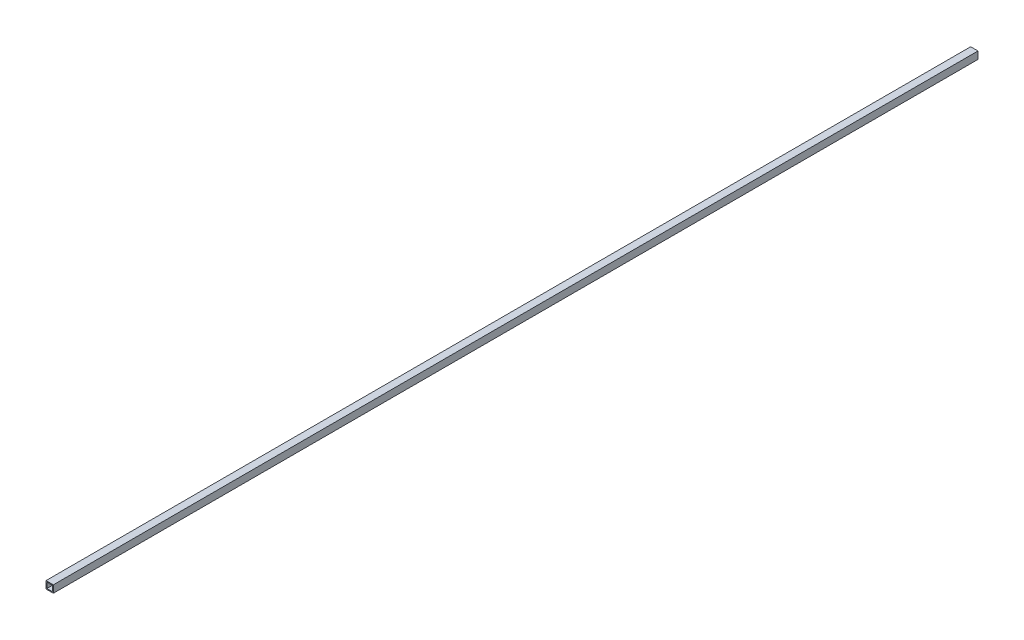
ISO-10303-21;
HEADER;
FILE_DESCRIPTION(('STEP AP214'),'2;1');
FILE_NAME('part.step','',(''),(''),'','','');
FILE_SCHEMA(('AUTOMOTIVE_DESIGN { 1 0 10303 214 1 1 1 1 }'));
ENDSEC;
DATA;
#1=APPLICATION_CONTEXT('core data for automotive mechanical design processes');
#2=APPLICATION_PROTOCOL_DEFINITION('international standard','automotive_design',2000,#1);
#3=PRODUCT_CONTEXT('',#1,'mechanical');
#4=PRODUCT('Part','Part','',(#3));
#5=PRODUCT_RELATED_PRODUCT_CATEGORY('part','',(#4));
#6=PRODUCT_DEFINITION_FORMATION('','',#4);
#7=PRODUCT_DEFINITION_CONTEXT('part definition',#1,'design');
#8=PRODUCT_DEFINITION('design','',#6,#7);
#9=PRODUCT_DEFINITION_SHAPE('','',#8);
#10=(LENGTH_UNIT() NAMED_UNIT(*) SI_UNIT(.MILLI.,.METRE.));
#11=(NAMED_UNIT(*) PLANE_ANGLE_UNIT() SI_UNIT($,.RADIAN.));
#12=(NAMED_UNIT(*) SI_UNIT($,.STERADIAN.) SOLID_ANGLE_UNIT());
#13=UNCERTAINTY_MEASURE_WITH_UNIT(LENGTH_MEASURE(1.E-05),#10,'distance_accuracy_value','');
#14=(GEOMETRIC_REPRESENTATION_CONTEXT(3) GLOBAL_UNCERTAINTY_ASSIGNED_CONTEXT((#13)) GLOBAL_UNIT_ASSIGNED_CONTEXT((#10,
#11,#12)) REPRESENTATION_CONTEXT('',''));
#15=CARTESIAN_POINT('',(0.,0.,0.));
#16=DIRECTION('',(0.,0.,1.));
#17=DIRECTION('',(1.,0.,0.));
#18=AXIS2_PLACEMENT_3D('',#15,#16,#17);
#19=CARTESIAN_POINT('',(0.,0.,1600.));
#20=DIRECTION('',(0.,0.,1.));
#21=DIRECTION('',(1.,0.,0.));
#22=AXIS2_PLACEMENT_3D('',#19,#20,#21);
#23=PLANE('',#22);
#24=DIRECTION('',(0.,-1.,0.));
#25=VECTOR('',#24,1.);
#26=CARTESIAN_POINT('',(-6.35,6.35,1600.));
#27=LINE('',#26,#25);
#28=CARTESIAN_POINT('',(-6.35,6.35,1600.));
#29=VERTEX_POINT('',#28);
#30=CARTESIAN_POINT('',(-6.35,-6.35,1600.));
#31=VERTEX_POINT('',#30);
#32=EDGE_CURVE('E137',#29,#31,#27,.T.);
#33=ORIENTED_EDGE('',*,*,#32,.T.);
#34=DIRECTION('',(1.,0.,0.));
#35=VECTOR('',#34,1.);
#36=CARTESIAN_POINT('',(-6.35,-6.35,1600.));
#37=LINE('',#36,#35);
#38=CARTESIAN_POINT('',(6.35,-6.35,1600.));
#39=VERTEX_POINT('',#38);
#40=EDGE_CURVE('E140',#31,#39,#37,.T.);
#41=ORIENTED_EDGE('',*,*,#40,.T.);
#42=DIRECTION('',(0.,1.,0.));
#43=VECTOR('',#42,1.);
#44=CARTESIAN_POINT('',(6.35,6.35,1600.));
#45=LINE('',#44,#43);
#46=CARTESIAN_POINT('',(6.35,6.35,1600.));
#47=VERTEX_POINT('',#46);
#48=EDGE_CURVE('E143',#39,#47,#45,.T.);
#49=ORIENTED_EDGE('',*,*,#48,.T.);
#50=DIRECTION('',(-1.,0.,0.));
#51=VECTOR('',#50,1.);
#52=CARTESIAN_POINT('',(-6.35,6.35,1600.));
#53=LINE('',#52,#51);
#54=EDGE_CURVE('E145',#47,#29,#53,.T.);
#55=ORIENTED_EDGE('',*,*,#54,.T.);
#56=EDGE_LOOP('',(#33,#41,#49,#55));
#57=FACE_BOUND('',#56,.T.);
#58=DIRECTION('',(1.,0.,0.));
#59=VECTOR('',#58,1.);
#60=CARTESIAN_POINT('',(-4.7625,-4.7625,1600.));
#61=LINE('',#60,#59);
#62=CARTESIAN_POINT('',(-4.7625,-4.7625,1600.));
#63=VERTEX_POINT('',#62);
#64=CARTESIAN_POINT('',(4.7625,-4.7625,1600.));
#65=VERTEX_POINT('',#64);
#66=EDGE_CURVE('E109',#63,#65,#61,.T.);
#67=ORIENTED_EDGE('',*,*,#66,.F.);
#68=DIRECTION('',(0.,-1.,0.));
#69=VECTOR('',#68,1.);
#70=CARTESIAN_POINT('',(-4.7625,4.7625,1600.));
#71=LINE('',#70,#69);
#72=CARTESIAN_POINT('',(-4.7625,4.7625,1600.));
#73=VERTEX_POINT('',#72);
#74=EDGE_CURVE('E101',#73,#63,#71,.T.);
#75=ORIENTED_EDGE('',*,*,#74,.F.);
#76=DIRECTION('',(-1.,0.,0.));
#77=VECTOR('',#76,1.);
#78=CARTESIAN_POINT('',(-4.7625,4.7625,1600.));
#79=LINE('',#78,#77);
#80=CARTESIAN_POINT('',(4.7625,4.7625,1600.));
#81=VERTEX_POINT('',#80);
#82=EDGE_CURVE('E123',#81,#73,#79,.T.);
#83=ORIENTED_EDGE('',*,*,#82,.F.);
#84=DIRECTION('',(0.,1.,0.));
#85=VECTOR('',#84,1.);
#86=CARTESIAN_POINT('',(4.7625,4.7625,1600.));
#87=LINE('',#86,#85);
#88=EDGE_CURVE('E121',#65,#81,#87,.T.);
#89=ORIENTED_EDGE('',*,*,#88,.F.);
#90=EDGE_LOOP('',(#67,#75,#83,#89));
#91=FACE_BOUND('',#90,.T.);
#92=ADVANCED_FACE('F36',(#57,#91),#23,.T.);
#93=CARTESIAN_POINT('',(0.,0.,0.));
#94=DIRECTION('',(0.,0.,1.));
#95=DIRECTION('',(1.,0.,0.));
#96=AXIS2_PLACEMENT_3D('',#93,#94,#95);
#97=PLANE('',#96);
#98=DIRECTION('',(0.,-1.,0.));
#99=VECTOR('',#98,1.);
#100=CARTESIAN_POINT('',(-6.35,6.35,0.));
#101=LINE('',#100,#99);
#102=CARTESIAN_POINT('',(-6.35,6.35,0.));
#103=VERTEX_POINT('',#102);
#104=CARTESIAN_POINT('',(-6.35,-6.35,0.));
#105=VERTEX_POINT('',#104);
#106=EDGE_CURVE('E117',#103,#105,#101,.T.);
#107=ORIENTED_EDGE('',*,*,#106,.F.);
#108=DIRECTION('',(-1.,0.,0.));
#109=VECTOR('',#108,1.);
#110=CARTESIAN_POINT('',(-6.35,6.35,0.));
#111=LINE('',#110,#109);
#112=CARTESIAN_POINT('',(6.35,6.35,0.));
#113=VERTEX_POINT('',#112);
#114=EDGE_CURVE('E141',#113,#103,#111,.T.);
#115=ORIENTED_EDGE('',*,*,#114,.F.);
#116=DIRECTION('',(0.,1.,0.));
#117=VECTOR('',#116,1.);
#118=CARTESIAN_POINT('',(6.35,6.35,0.));
#119=LINE('',#118,#117);
#120=CARTESIAN_POINT('',(6.35,-6.35,0.));
#121=VERTEX_POINT('',#120);
#122=EDGE_CURVE('E152',#121,#113,#119,.T.);
#123=ORIENTED_EDGE('',*,*,#122,.F.);
#124=DIRECTION('',(1.,0.,0.));
#125=VECTOR('',#124,1.);
#126=CARTESIAN_POINT('',(-6.35,-6.35,0.));
#127=LINE('',#126,#125);
#128=EDGE_CURVE('E150',#105,#121,#127,.T.);
#129=ORIENTED_EDGE('',*,*,#128,.F.);
#130=EDGE_LOOP('',(#107,#115,#123,#129));
#131=FACE_BOUND('',#130,.T.);
#132=DIRECTION('',(0.,-1.,0.));
#133=VECTOR('',#132,1.);
#134=CARTESIAN_POINT('',(-4.7625,4.7625,0.));
#135=LINE('',#134,#133);
#136=CARTESIAN_POINT('',(-4.7625,4.7625,0.));
#137=VERTEX_POINT('',#136);
#138=CARTESIAN_POINT('',(-4.7625,-4.7625,0.));
#139=VERTEX_POINT('',#138);
#140=EDGE_CURVE('E59',#137,#139,#135,.T.);
#141=ORIENTED_EDGE('',*,*,#140,.T.);
#142=DIRECTION('',(1.,0.,0.));
#143=VECTOR('',#142,1.);
#144=CARTESIAN_POINT('',(-4.7625,-4.7625,0.));
#145=LINE('',#144,#143);
#146=CARTESIAN_POINT('',(4.7625,-4.7625,0.));
#147=VERTEX_POINT('',#146);
#148=EDGE_CURVE('E116',#139,#147,#145,.T.);
#149=ORIENTED_EDGE('',*,*,#148,.T.);
#150=DIRECTION('',(0.,1.,0.));
#151=VECTOR('',#150,1.);
#152=CARTESIAN_POINT('',(4.7625,4.7625,0.));
#153=LINE('',#152,#151);
#154=CARTESIAN_POINT('',(4.7625,4.7625,0.));
#155=VERTEX_POINT('',#154);
#156=EDGE_CURVE('E129',#147,#155,#153,.T.);
#157=ORIENTED_EDGE('',*,*,#156,.T.);
#158=DIRECTION('',(-1.,0.,0.));
#159=VECTOR('',#158,1.);
#160=CARTESIAN_POINT('',(-4.7625,4.7625,0.));
#161=LINE('',#160,#159);
#162=EDGE_CURVE('E110',#155,#137,#161,.T.);
#163=ORIENTED_EDGE('',*,*,#162,.T.);
#164=EDGE_LOOP('',(#141,#149,#157,#163));
#165=FACE_BOUND('',#164,.T.);
#166=ADVANCED_FACE('F170',(#131,#165),#97,.F.);
#167=CARTESIAN_POINT('',(-6.35,6.35,1600.));
#168=DIRECTION('',(1.,0.,0.));
#169=DIRECTION('',(0.,0.,-1.));
#170=AXIS2_PLACEMENT_3D('',#167,#168,#169);
#171=PLANE('',#170);
#172=ORIENTED_EDGE('',*,*,#106,.T.);
#173=DIRECTION('',(0.,0.,-1.));
#174=VECTOR('',#173,1.);
#175=CARTESIAN_POINT('',(-6.35,-6.35,1600.));
#176=LINE('',#175,#174);
#177=EDGE_CURVE('E11',#31,#105,#176,.T.);
#178=ORIENTED_EDGE('',*,*,#177,.F.);
#179=ORIENTED_EDGE('',*,*,#32,.F.);
#180=DIRECTION('',(0.,0.,-1.));
#181=VECTOR('',#180,1.);
#182=CARTESIAN_POINT('',(-6.35,6.35,1600.));
#183=LINE('',#182,#181);
#184=EDGE_CURVE('E147',#29,#103,#183,.T.);
#185=ORIENTED_EDGE('',*,*,#184,.T.);
#186=EDGE_LOOP('',(#172,#178,#179,#185));
#187=FACE_BOUND('',#186,.T.);
#188=ADVANCED_FACE('F38',(#187),#171,.F.);
#189=CARTESIAN_POINT('',(-6.35,-6.35,1600.));
#190=DIRECTION('',(0.,1.,0.));
#191=DIRECTION('',(0.,0.,1.));
#192=AXIS2_PLACEMENT_3D('',#189,#190,#191);
#193=PLANE('',#192);
#194=ORIENTED_EDGE('',*,*,#128,.T.);
#195=DIRECTION('',(0.,0.,-1.));
#196=VECTOR('',#195,1.);
#197=CARTESIAN_POINT('',(6.35,-6.35,1600.));
#198=LINE('',#197,#196);
#199=EDGE_CURVE('E44',#39,#121,#198,.T.);
#200=ORIENTED_EDGE('',*,*,#199,.F.);
#201=ORIENTED_EDGE('',*,*,#40,.F.);
#202=ORIENTED_EDGE('',*,*,#177,.T.);
#203=EDGE_LOOP('',(#194,#200,#201,#202));
#204=FACE_BOUND('',#203,.T.);
#205=ADVANCED_FACE('F180',(#204),#193,.F.);
#206=CARTESIAN_POINT('',(6.35,6.35,1600.));
#207=DIRECTION('',(-1.,0.,0.));
#208=DIRECTION('',(0.,0.,1.));
#209=AXIS2_PLACEMENT_3D('',#206,#207,#208);
#210=PLANE('',#209);
#211=ORIENTED_EDGE('',*,*,#122,.T.);
#212=DIRECTION('',(0.,0.,-1.));
#213=VECTOR('',#212,1.);
#214=CARTESIAN_POINT('',(6.35,6.35,1600.));
#215=LINE('',#214,#213);
#216=EDGE_CURVE('E157',#47,#113,#215,.T.);
#217=ORIENTED_EDGE('',*,*,#216,.F.);
#218=ORIENTED_EDGE('',*,*,#48,.F.);
#219=ORIENTED_EDGE('',*,*,#199,.T.);
#220=EDGE_LOOP('',(#211,#217,#218,#219));
#221=FACE_BOUND('',#220,.T.);
#222=ADVANCED_FACE('F164',(#221),#210,.F.);
#223=CARTESIAN_POINT('',(-6.35,6.35,1600.));
#224=DIRECTION('',(0.,-1.,0.));
#225=DIRECTION('',(0.,0.,-1.));
#226=AXIS2_PLACEMENT_3D('',#223,#224,#225);
#227=PLANE('',#226);
#228=ORIENTED_EDGE('',*,*,#114,.T.);
#229=ORIENTED_EDGE('',*,*,#184,.F.);
#230=ORIENTED_EDGE('',*,*,#54,.F.);
#231=ORIENTED_EDGE('',*,*,#216,.T.);
#232=EDGE_LOOP('',(#228,#229,#230,#231));
#233=FACE_BOUND('',#232,.T.);
#234=ADVANCED_FACE('F174',(#233),#227,.F.);
#235=CARTESIAN_POINT('',(-4.7625,4.7625,1600.));
#236=DIRECTION('',(1.,0.,0.));
#237=DIRECTION('',(0.,0.,-1.));
#238=AXIS2_PLACEMENT_3D('',#235,#236,#237);
#239=PLANE('',#238);
#240=ORIENTED_EDGE('',*,*,#140,.F.);
#241=DIRECTION('',(0.,0.,-1.));
#242=VECTOR('',#241,1.);
#243=CARTESIAN_POINT('',(-4.7625,4.7625,1600.));
#244=LINE('',#243,#242);
#245=EDGE_CURVE('E105',#73,#137,#244,.T.);
#246=ORIENTED_EDGE('',*,*,#245,.F.);
#247=ORIENTED_EDGE('',*,*,#74,.T.);
#248=DIRECTION('',(0.,0.,-1.));
#249=VECTOR('',#248,1.);
#250=CARTESIAN_POINT('',(-4.7625,-4.7625,1600.));
#251=LINE('',#250,#249);
#252=EDGE_CURVE('E104',#63,#139,#251,.T.);
#253=ORIENTED_EDGE('',*,*,#252,.T.);
#254=EDGE_LOOP('',(#240,#246,#247,#253));
#255=FACE_BOUND('',#254,.T.);
#256=ADVANCED_FACE('F103',(#255),#239,.T.);
#257=CARTESIAN_POINT('',(-4.7625,-4.7625,1600.));
#258=DIRECTION('',(0.,1.,0.));
#259=DIRECTION('',(-1.,0.,0.));
#260=AXIS2_PLACEMENT_3D('',#257,#258,#259);
#261=PLANE('',#260);
#262=ORIENTED_EDGE('',*,*,#148,.F.);
#263=ORIENTED_EDGE('',*,*,#252,.F.);
#264=ORIENTED_EDGE('',*,*,#66,.T.);
#265=DIRECTION('',(0.,0.,-1.));
#266=VECTOR('',#265,1.);
#267=CARTESIAN_POINT('',(4.7625,-4.7625,1600.));
#268=LINE('',#267,#266);
#269=EDGE_CURVE('E118',#65,#147,#268,.T.);
#270=ORIENTED_EDGE('',*,*,#269,.T.);
#271=EDGE_LOOP('',(#262,#263,#264,#270));
#272=FACE_BOUND('',#271,.T.);
#273=ADVANCED_FACE('F113',(#272),#261,.T.);
#274=CARTESIAN_POINT('',(4.7625,4.7625,1600.));
#275=DIRECTION('',(-1.,0.,0.));
#276=DIRECTION('',(0.,0.,1.));
#277=AXIS2_PLACEMENT_3D('',#274,#275,#276);
#278=PLANE('',#277);
#279=ORIENTED_EDGE('',*,*,#156,.F.);
#280=ORIENTED_EDGE('',*,*,#269,.F.);
#281=ORIENTED_EDGE('',*,*,#88,.T.);
#282=DIRECTION('',(0.,0.,-1.));
#283=VECTOR('',#282,1.);
#284=CARTESIAN_POINT('',(4.7625,4.7625,1600.));
#285=LINE('',#284,#283);
#286=EDGE_CURVE('E51',#81,#155,#285,.T.);
#287=ORIENTED_EDGE('',*,*,#286,.T.);
#288=EDGE_LOOP('',(#279,#280,#281,#287));
#289=FACE_BOUND('',#288,.T.);
#290=ADVANCED_FACE('F203',(#289),#278,.T.);
#291=CARTESIAN_POINT('',(-4.7625,4.7625,1600.));
#292=DIRECTION('',(0.,-1.,0.));
#293=DIRECTION('',(0.,0.,-1.));
#294=AXIS2_PLACEMENT_3D('',#291,#292,#293);
#295=PLANE('',#294);
#296=ORIENTED_EDGE('',*,*,#162,.F.);
#297=ORIENTED_EDGE('',*,*,#286,.F.);
#298=ORIENTED_EDGE('',*,*,#82,.T.);
#299=ORIENTED_EDGE('',*,*,#245,.T.);
#300=EDGE_LOOP('',(#296,#297,#298,#299));
#301=FACE_BOUND('',#300,.T.);
#302=ADVANCED_FACE('F207',(#301),#295,.T.);
#303=CLOSED_SHELL('',(#92,#166,#188,#205,#222,#234,#256,#273,#290,#302));
#304=MANIFOLD_SOLID_BREP('B2',#303);
#305=ADVANCED_BREP_SHAPE_REPRESENTATION('',(#18,#304),#14);
#306=SHAPE_DEFINITION_REPRESENTATION(#9,#305);
ENDSEC;
END-ISO-10303-21;
